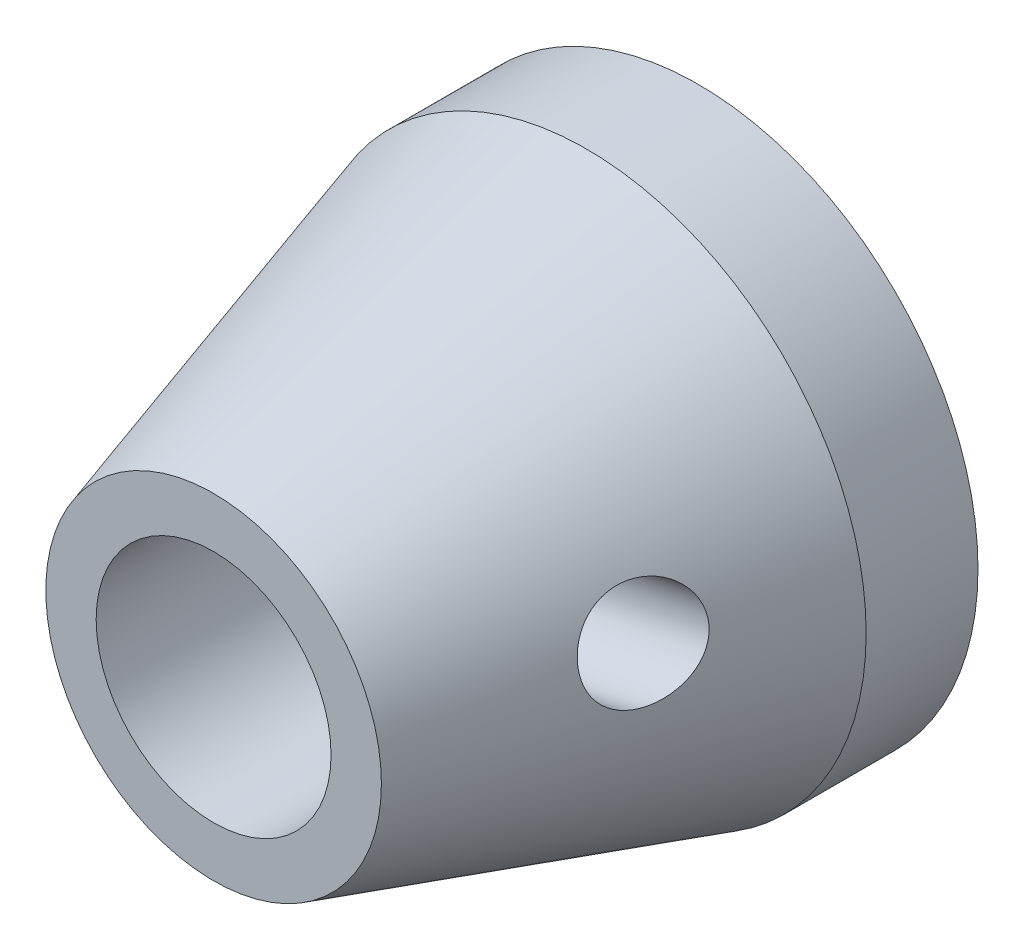
ISO-10303-21;
HEADER;
FILE_DESCRIPTION(('STEP AP214'),'2;1');
FILE_NAME('part.step','',(''),(''),'','','');
FILE_SCHEMA(('AUTOMOTIVE_DESIGN { 1 0 10303 214 1 1 1 1 }'));
ENDSEC;
DATA;
#1=APPLICATION_CONTEXT('core data for automotive mechanical design processes');
#2=APPLICATION_PROTOCOL_DEFINITION('international standard','automotive_design',2000,#1);
#3=PRODUCT_CONTEXT('',#1,'mechanical');
#4=PRODUCT('Part','Part','',(#3));
#5=PRODUCT_RELATED_PRODUCT_CATEGORY('part','',(#4));
#6=PRODUCT_DEFINITION_FORMATION('','',#4);
#7=PRODUCT_DEFINITION_CONTEXT('part definition',#1,'design');
#8=PRODUCT_DEFINITION('design','',#6,#7);
#9=PRODUCT_DEFINITION_SHAPE('','',#8);
#10=(LENGTH_UNIT() NAMED_UNIT(*) SI_UNIT(.MILLI.,.METRE.));
#11=(NAMED_UNIT(*) PLANE_ANGLE_UNIT() SI_UNIT($,.RADIAN.));
#12=(NAMED_UNIT(*) SI_UNIT($,.STERADIAN.) SOLID_ANGLE_UNIT());
#13=UNCERTAINTY_MEASURE_WITH_UNIT(LENGTH_MEASURE(1.E-05),#10,'distance_accuracy_value','');
#14=(GEOMETRIC_REPRESENTATION_CONTEXT(3) GLOBAL_UNCERTAINTY_ASSIGNED_CONTEXT((#13)) GLOBAL_UNIT_ASSIGNED_CONTEXT((#10,
#11,#12)) REPRESENTATION_CONTEXT('',''));
#15=CARTESIAN_POINT('',(0.,0.,0.));
#16=DIRECTION('',(0.,0.,1.));
#17=DIRECTION('',(1.,0.,0.));
#18=AXIS2_PLACEMENT_3D('',#15,#16,#17);
#19=CARTESIAN_POINT('',(18.1431082575943,29.9368359977339,3.));
#20=DIRECTION('',(0.,0.,-1.));
#21=DIRECTION('',(-1.,0.,0.));
#22=AXIS2_PLACEMENT_3D('',#19,#20,#21);
#23=CYLINDRICAL_SURFACE('',#22,7.5);
#24=CARTESIAN_POINT('',(18.1431082575943,29.9368359977339,3.));
#25=DIRECTION('',(0.,0.,1.));
#26=DIRECTION('',(1.,0.,0.));
#27=AXIS2_PLACEMENT_3D('',#24,#25,#26);
#28=CIRCLE('',#27,7.5);
#29=CARTESIAN_POINT('',(25.6431082575943,29.9368359977339,3.));
#30=VERTEX_POINT('',#29);
#31=EDGE_CURVE('E55',#30,#30,#28,.T.);
#32=ORIENTED_EDGE('',*,*,#31,.F.);
#33=EDGE_LOOP('',(#32));
#34=FACE_BOUND('',#33,.T.);
#35=CARTESIAN_POINT('',(18.1431082575943,29.9368359977339,0.));
#36=DIRECTION('',(0.,0.,1.));
#37=DIRECTION('',(1.,0.,0.));
#38=AXIS2_PLACEMENT_3D('',#35,#36,#37);
#39=CIRCLE('',#38,7.5);
#40=CARTESIAN_POINT('',(25.6431082575943,29.9368359977339,0.));
#41=VERTEX_POINT('',#40);
#42=EDGE_CURVE('E60',#41,#41,#39,.T.);
#43=ORIENTED_EDGE('',*,*,#42,.T.);
#44=EDGE_LOOP('',(#43));
#45=FACE_BOUND('',#44,.T.);
#46=ADVANCED_FACE('F41',(#34,#45),#23,.T.);
#47=CARTESIAN_POINT('',(18.1431082575943,29.9368359977339,0.));
#48=DIRECTION('',(0.,0.,1.));
#49=DIRECTION('',(1.,0.,0.));
#50=AXIS2_PLACEMENT_3D('',#47,#48,#49);
#51=PLANE('',#50);
#52=CARTESIAN_POINT('',(18.1431082575943,29.9368359977339,0.));
#53=DIRECTION('',(0.,0.,1.));
#54=DIRECTION('',(1.,0.,0.));
#55=AXIS2_PLACEMENT_3D('',#52,#53,#54);
#56=CIRCLE('',#55,1.65);
#57=CARTESIAN_POINT('',(19.7931082575943,29.9368359977339,0.));
#58=VERTEX_POINT('',#57);
#59=EDGE_CURVE('E123',#58,#58,#56,.F.);
#60=ORIENTED_EDGE('',*,*,#59,.F.);
#61=EDGE_LOOP('',(#60));
#62=FACE_BOUND('',#61,.T.);
#63=ORIENTED_EDGE('',*,*,#42,.F.);
#64=EDGE_LOOP('',(#63));
#65=FACE_BOUND('',#64,.T.);
#66=ADVANCED_FACE('F101',(#62,#65),#51,.F.);
#67=CARTESIAN_POINT('',(18.1431082575943,29.9368359977339,13.));
#68=DIRECTION('',(0.,0.,1.));
#69=DIRECTION('',(1.,0.,0.));
#70=AXIS2_PLACEMENT_3D('',#67,#68,#69);
#71=PLANE('',#70);
#72=CARTESIAN_POINT('',(18.1431082575943,29.9368359977339,13.));
#73=DIRECTION('',(0.,0.,1.));
#74=DIRECTION('',(1.,0.,0.));
#75=AXIS2_PLACEMENT_3D('',#72,#73,#74);
#76=CIRCLE('',#75,4.5);
#77=CARTESIAN_POINT('',(22.6431082575943,29.9368359977339,13.));
#78=VERTEX_POINT('',#77);
#79=EDGE_CURVE('E117',#78,#78,#76,.T.);
#80=ORIENTED_EDGE('',*,*,#79,.T.);
#81=EDGE_LOOP('',(#80));
#82=FACE_BOUND('',#81,.T.);
#83=CARTESIAN_POINT('',(18.1431082575943,29.9368359977339,13.));
#84=DIRECTION('',(0.,0.,1.));
#85=DIRECTION('',(1.,0.,0.));
#86=AXIS2_PLACEMENT_3D('',#83,#84,#85);
#87=CIRCLE('',#86,3.15);
#88=CARTESIAN_POINT('',(21.2931082575943,29.9368359977339,13.));
#89=VERTEX_POINT('',#88);
#90=EDGE_CURVE('E119',#89,#89,#87,.T.);
#91=ORIENTED_EDGE('',*,*,#90,.F.);
#92=EDGE_LOOP('',(#91));
#93=FACE_BOUND('',#92,.T.);
#94=ADVANCED_FACE('F96',(#82,#93),#71,.T.);
#95=CARTESIAN_POINT('',(18.1431082575943,29.9368359977339,13.));
#96=DIRECTION('',(0.,0.,-1.));
#97=DIRECTION('',(-1.,0.,0.));
#98=AXIS2_PLACEMENT_3D('',#95,#96,#97);
#99=CYLINDRICAL_SURFACE('',#98,3.15);
#100=CARTESIAN_POINT('',(14.9931082575943,29.9368359977339,8.6903802701411));
#101=CARTESIAN_POINT('',(14.9931102999461,29.8732132676432,8.72370931606805));
#102=CARTESIAN_POINT('',(14.9950505986868,29.8070080103212,8.75229520565875));
#103=CARTESIAN_POINT('',(15.0035908596131,29.6711896883862,8.798976753954));
#104=CARTESIAN_POINT('',(15.0101974703728,29.6015718934447,8.81705737765284));
#105=CARTESIAN_POINT('',(15.0284677580875,29.4608646789268,8.84198872866573));
#106=CARTESIAN_POINT('',(15.0401389585906,29.3897732203883,8.84882267615486));
#107=CARTESIAN_POINT('',(15.0684052478466,29.2484373848096,8.850897276917));
#108=CARTESIAN_POINT('',(15.0849980980908,29.1781926377431,8.8461431936816));
#109=CARTESIAN_POINT('',(15.121910794454,29.0425961940166,8.82557138585311));
#110=CARTESIAN_POINT('',(15.1421093683967,28.9771618103116,8.81007665355229));
#111=CARTESIAN_POINT('',(15.1855509156751,28.8506344207,8.76896460983401));
#112=CARTESIAN_POINT('',(15.2087946047318,28.7895424406515,8.74334491579106));
#113=CARTESIAN_POINT('',(15.257927086223,28.6709397776285,8.68177277019199));
#114=CARTESIAN_POINT('',(15.2838794442189,28.6136251792924,8.64549453545055));
#115=CARTESIAN_POINT('',(15.3362120939258,28.5059539075079,8.56401000361812));
#116=CARTESIAN_POINT('',(15.3625925628893,28.4556002027075,8.51879991715836));
#117=CARTESIAN_POINT('',(15.4161128865017,28.3590951722122,8.41675925546413));
#118=CARTESIAN_POINT('',(15.4431606668415,28.313544608485,8.35931048806948));
#119=CARTESIAN_POINT('',(15.4938076812394,28.2321333885885,8.2365274257616));
#120=CARTESIAN_POINT('',(15.5174060908371,28.1962750472976,8.17119125241085));
#121=CARTESIAN_POINT('',(15.5593305516761,28.1346127458998,8.03314268948219));
#122=CARTESIAN_POINT('',(15.5775786007019,28.1089557625159,7.96034024693515));
#123=CARTESIAN_POINT('',(15.6063302001096,28.0692519907563,7.81019757533648));
#124=CARTESIAN_POINT('',(15.6168407176798,28.0551947561121,7.73286149647984));
#125=CARTESIAN_POINT('',(15.6283147965662,28.0398921889111,7.58272004634911));
#126=CARTESIAN_POINT('',(15.6299937043849,28.037686545542,7.5100664814923));
#127=CARTESIAN_POINT('',(15.6255449150962,28.0435878033745,7.36542876920287));
#128=CARTESIAN_POINT('',(15.6194183116316,28.051693259871,7.29344452941338));
#129=CARTESIAN_POINT('',(15.6005182889504,28.0772745730684,7.15574778421628));
#130=CARTESIAN_POINT('',(15.5880786912904,28.0942810516217,7.08990014599403));
#131=CARTESIAN_POINT('',(15.5578952996415,28.1368771427343,6.96233549165208));
#132=CARTESIAN_POINT('',(15.5401500293559,28.1624691444468,6.90061963105168));
#133=CARTESIAN_POINT('',(15.4994660756599,28.2236264775347,6.77868807451138));
#134=CARTESIAN_POINT('',(15.4762643231326,28.2597330341089,6.71883219601746));
#135=CARTESIAN_POINT('',(15.4271903802773,28.3404278071716,6.60635109748906));
#136=CARTESIAN_POINT('',(15.4013169277564,28.3850200410163,6.55372932268774));
#137=CARTESIAN_POINT('',(15.3466048847592,28.4857685103556,6.4530557577431));
#138=CARTESIAN_POINT('',(15.3176913584886,28.542550676542,6.405667553977));
#139=CARTESIAN_POINT('',(15.2608650551166,28.6641724693107,6.3218758661977));
#140=CARTESIAN_POINT('',(15.2329521533182,28.729011087375,6.28547100922571));
#141=CARTESIAN_POINT('',(15.1805704826976,28.8639880168436,6.22554238706371));
#142=CARTESIAN_POINT('',(15.1560451353999,28.9339982237519,6.20178112896172));
#143=CARTESIAN_POINT('',(15.1113800197387,29.0784508990138,6.167121220823));
#144=CARTESIAN_POINT('',(15.0912375848393,29.1528906371613,6.15621473208541));
#145=CARTESIAN_POINT('',(15.0577240840396,29.2980600736766,6.14809924687948));
#146=CARTESIAN_POINT('',(15.0439565961178,29.3686455537662,6.1499182575943));
#147=CARTESIAN_POINT('',(15.0214296211514,29.5094008067714,6.16490085463192));
#148=CARTESIAN_POINT('',(15.0126697510674,29.5795706110761,6.17806357306633));
#149=CARTESIAN_POINT('',(15.00012238538,29.7160458586902,6.21481334315896));
#150=CARTESIAN_POINT('',(14.9962393233295,29.7824004345599,6.23818753628852));
#151=CARTESIAN_POINT('',(14.9925560875365,29.9110288426966,6.29450035550992));
#152=CARTESIAN_POINT('',(14.992756868607,29.9733017172369,6.32744121653859));
#153=CARTESIAN_POINT('',(14.9964929991104,30.0958794650638,6.40419707965138));
#154=CARTESIAN_POINT('',(15.0002266837405,30.1558449676796,6.44854381568185));
#155=CARTESIAN_POINT('',(15.010070022512,30.2681274530824,6.54585496528117));
#156=CARTESIAN_POINT('',(15.0161809303462,30.3204403800123,6.59882391742225));
#157=CARTESIAN_POINT('',(15.0298247341782,30.419129114165,6.71594038840492));
#158=CARTESIAN_POINT('',(15.0374239020023,30.464904812631,6.78058839950458));
#159=CARTESIAN_POINT('',(15.0520236845114,30.5445729939757,6.91691126212507));
#160=CARTESIAN_POINT('',(15.059024455735,30.5784685918856,6.98858426533552));
#161=CARTESIAN_POINT('',(15.0706581150524,30.6320242570857,7.13496094602848));
#162=CARTESIAN_POINT('',(15.0753526505968,30.6520615627288,7.20952057752174));
#163=CARTESIAN_POINT('',(15.0815790051972,30.6782734334692,7.36114829270059));
#164=CARTESIAN_POINT('',(15.0831132799977,30.6844587628505,7.43821438135033));
#165=CARTESIAN_POINT('',(15.0826835952195,30.6826873322882,7.58529082038846));
#166=CARTESIAN_POINT('',(15.0810183248014,30.6759381996436,7.65531972335324));
#167=CARTESIAN_POINT('',(15.075108232488,30.6510049707577,7.79318558873972));
#168=CARTESIAN_POINT('',(15.0708633283911,30.6328205101222,7.86102248123915));
#169=CARTESIAN_POINT('',(15.0606229828806,30.5859522861719,7.99253064032278));
#170=CARTESIAN_POINT('',(15.0546335185566,30.5573042885632,8.05621523626327));
#171=CARTESIAN_POINT('',(15.0419719894604,30.4905549053651,8.17838808276881));
#172=CARTESIAN_POINT('',(15.0352993369767,30.4524453396399,8.23687177708087));
#173=CARTESIAN_POINT('',(15.0218855808405,30.3641896793113,8.35239898835284));
#174=CARTESIAN_POINT('',(15.0151900242661,30.3132799839146,8.40886395678522));
#175=CARTESIAN_POINT('',(15.0038975401614,30.2031165074626,8.51304816710982));
#176=CARTESIAN_POINT('',(14.9992965334467,30.1438792417329,8.5607842991297));
#177=CARTESIAN_POINT('',(14.9953565583146,30.0580849197158,8.61942832390792));
#178=CARTESIAN_POINT('',(14.9945283756841,30.0344293861019,8.6346033240437));
#179=CARTESIAN_POINT('',(14.9934037779994,29.9862599630836,8.6635548360569));
#180=CARTESIAN_POINT('',(14.9931074579614,29.9617459211057,8.67733109763763));
#181=CARTESIAN_POINT('',(14.9931082575943,29.9368359977339,8.6903802701411));
#182=B_SPLINE_CURVE_WITH_KNOTS('',3,(#100,#101,#102,#103,#104,#105,#106,#107,#108,#109,#110,
#111,#112,#113,#114,#115,#116,#117,#118,#119,#120,#121,#122,#123,#124,#125,#126,#127,#128,#129,
#130,#131,#132,#133,#134,#135,#136,#137,#138,#139,#140,#141,#142,#143,#144,#145,#146,#147,#148,
#149,#150,#151,#152,#153,#154,#155,#156,#157,#158,#159,#160,#161,#162,#163,#164,#165,#166,#167,
#168,#169,#170,#171,#172,#173,#174,#175,#176,#177,#178,#179,#180,#181),.UNSPECIFIED.,.T.,.F.,(4,
2,2,2,2,2,2,2,2,2,2,2,2,2,2,2,2,2,2,2,2,2,2,2,2,2,2,2,2,2,2,2,2,2,2,2,2,2,2,2,4),(0.,
0.215371954980914,0.431051393154338,0.647052330136701,0.862955173899661,1.07263209017435,
1.28235837743291,1.49931524856291,1.71636436281924,1.94973540170888,2.18316212949799,
2.4198396693578,2.65630383358105,2.87328210404809,3.09022997668048,3.29674460097989,
3.50331674127458,3.72334981351538,3.94348731588041,4.18057024762912,4.41762353084774,
4.65005107796544,4.88233681980285,5.09708495222221,5.31181665607438,5.52227124250676,
5.73277503432513,5.95584444437429,6.17903165593587,6.41660616663915,6.65411833724638,
6.88487960297263,7.11546148324764,7.32555737183917,7.53565995561171,7.74505100184066,
7.95462371441831,8.18261944062646,8.41016922008784,8.49447777969649,8.57880139937391),.UNSPECIFIED.);
#183=CARTESIAN_POINT('',(14.9931082575943,29.9368359977339,8.6903802701411));
#184=VERTEX_POINT('',#183);
#185=EDGE_CURVE('E86',#184,#184,#182,.T.);
#186=ORIENTED_EDGE('',*,*,#185,.F.);
#187=EDGE_LOOP('',(#186));
#188=FACE_BOUND('',#187,.T.);
#189=CARTESIAN_POINT('',(21.2033056976846,29.1900484592298,7.5));
#190=CARTESIAN_POINT('',(21.2033123331083,29.1900586648814,7.57179203974133));
#191=CARTESIAN_POINT('',(21.2048400353248,29.1962497182343,7.64369232747785));
#192=CARTESIAN_POINT('',(21.2106517232002,29.220718831068,7.78540499676614));
#193=CARTESIAN_POINT('',(21.2149429892816,29.2390288206157,7.85521135212466));
#194=CARTESIAN_POINT('',(21.2253896481857,29.2867356099237,7.99042434761806));
#195=CARTESIAN_POINT('',(21.2315371202108,29.3160854288203,8.05584826680994));
#196=CARTESIAN_POINT('',(21.2445373632063,29.3847019420582,8.18113613649208));
#197=CARTESIAN_POINT('',(21.2513899955786,29.4239666898347,8.24100117518709));
#198=CARTESIAN_POINT('',(21.2649255226369,29.5138244942902,8.35745242405488));
#199=CARTESIAN_POINT('',(21.2715737595632,29.5649545860029,8.41362845773381));
#200=CARTESIAN_POINT('',(21.2827481359544,29.6755863489937,8.51731619916038));
#201=CARTESIAN_POINT('',(21.2872734302395,29.735091342228,8.56482445152406));
#202=CARTESIAN_POINT('',(21.2929521272611,29.8638843039658,8.65196355417216));
#203=CARTESIAN_POINT('',(21.2939394938036,29.9334979080979,8.69112713561755));
#204=CARTESIAN_POINT('',(21.2907652361011,30.0781821345047,8.75728390279428));
#205=CARTESIAN_POINT('',(21.2866060267331,30.1532501818925,8.78428278833935));
#206=CARTESIAN_POINT('',(21.2726926650068,30.302192978715,8.82383925950499));
#207=CARTESIAN_POINT('',(21.2632568575722,30.3759085572793,8.83710572923458));
#208=CARTESIAN_POINT('',(21.2388781984814,30.5236078226104,8.85111721535495));
#209=CARTESIAN_POINT('',(21.2239377210617,30.5975913801924,8.85186762364035));
#210=CARTESIAN_POINT('',(21.19015077949,30.7386834022754,8.84118438804883));
#211=CARTESIAN_POINT('',(21.1716173446412,30.8059280042669,8.83053129002295));
#212=CARTESIAN_POINT('',(21.1309834842592,30.9367329666784,8.79868916910532));
#213=CARTESIAN_POINT('',(21.1088827952067,31.000293054445,8.77749936760797));
#214=CARTESIAN_POINT('',(21.061908815014,31.1232182864513,8.72494203462347));
#215=CARTESIAN_POINT('',(21.0369982709486,31.1825043526853,8.69342371844265));
#216=CARTESIAN_POINT('',(20.9860810163695,31.2947047633271,8.62125719008991));
#217=CARTESIAN_POINT('',(20.9600739147864,31.3476168081478,8.58060569796081));
#218=CARTESIAN_POINT('',(20.9065604835131,31.4499145039647,8.48783572199136));
#219=CARTESIAN_POINT('',(20.8790855309455,31.4987499141898,8.43509150859398));
#220=CARTESIAN_POINT('',(20.8265598727467,31.5873651593718,8.32138372576544));
#221=CARTESIAN_POINT('',(20.8015102161043,31.6271410858922,8.26041662681346));
#222=CARTESIAN_POINT('',(20.7550276184109,31.6981560119895,8.12919905646493));
#223=CARTESIAN_POINT('',(20.7337598695236,31.7290308222147,8.05869113443951));
#224=CARTESIAN_POINT('',(20.6982088603245,31.7793673176642,7.91206994614886));
#225=CARTESIAN_POINT('',(20.6839202714298,31.79883771242,7.83596100750555));
#226=CARTESIAN_POINT('',(20.66471206039,31.8247605504148,7.68577224199478));
#227=CARTESIAN_POINT('',(20.6592253724931,31.8320026622733,7.61190195873212));
#228=CARTESIAN_POINT('',(20.6564617129317,31.8356679864171,7.46375296119587));
#229=CARTESIAN_POINT('',(20.6591816151748,31.8320953183169,7.38947441320021));
#230=CARTESIAN_POINT('',(20.6720273553529,31.8149111500967,7.24806184181678));
#231=CARTESIAN_POINT('',(20.6816256886468,31.8020141377903,7.18078991683315));
#232=CARTESIAN_POINT('',(20.70669996926,31.7673962547001,7.0497095356332));
#233=CARTESIAN_POINT('',(20.722177344344,31.7456732403734,6.98590192505451));
#234=CARTESIAN_POINT('',(20.7584748919893,31.6928043593388,6.86045554936948));
#235=CARTESIAN_POINT('',(20.7794981043604,31.6612898638036,6.7990317051816));
#236=CARTESIAN_POINT('',(20.8248735383275,31.5898406492679,6.6826421825184));
#237=CARTESIAN_POINT('',(20.8492272559306,31.549902141945,6.62767942700529));
#238=CARTESIAN_POINT('',(20.9018055351754,31.4583833233171,6.52078698349835));
#239=CARTESIAN_POINT('',(20.9301824989457,31.4060921131759,6.46953814327283));
#240=CARTESIAN_POINT('',(20.9868597142205,31.2931421198725,6.37718959320282));
#241=CARTESIAN_POINT('',(21.0151599577614,31.2324824995943,6.33609089985554));
#242=CARTESIAN_POINT('',(21.069876462244,31.1036451329714,6.26516278967528));
#243=CARTESIAN_POINT('',(21.0962827843243,31.0354319150311,6.23538972950171));
#244=CARTESIAN_POINT('',(21.1452668868866,30.8934790010462,6.18863259049895));
#245=CARTESIAN_POINT('',(21.1678470857643,30.8197428387433,6.17164040966204));
#246=CARTESIAN_POINT('',(21.2063511695743,30.674580271917,6.15199014407337));
#247=CARTESIAN_POINT('',(21.2226413254499,30.6033799370144,6.14837378489008));
#248=CARTESIAN_POINT('',(21.250146217795,30.460392439219,6.15296797931014));
#249=CARTESIAN_POINT('',(21.2613619374998,30.3886053927558,6.16117624045474));
#250=CARTESIAN_POINT('',(21.278309971166,30.2494636299278,6.1884990916241));
#251=CARTESIAN_POINT('',(21.2842397031008,30.1820454002422,6.20717428533945));
#252=CARTESIAN_POINT('',(21.2917458987167,30.0505205052547,6.25440722872897));
#253=CARTESIAN_POINT('',(21.2933215606806,29.9864144519578,6.28296679732932));
#254=CARTESIAN_POINT('',(21.2928376923784,29.8602459827444,6.35060566012319));
#255=CARTESIAN_POINT('',(21.2906090258735,29.7984102548672,6.39010546736101));
#256=CARTESIAN_POINT('',(21.2832913619921,29.6815213155669,6.47790596824713));
#257=CARTESIAN_POINT('',(21.2782012312395,29.6264708021894,6.52621014402576));
#258=CARTESIAN_POINT('',(21.2659951593817,29.5207702424316,6.63437595778368));
#259=CARTESIAN_POINT('',(21.2587589337482,29.4707302090851,6.69482220744656));
#260=CARTESIAN_POINT('',(21.2441090004343,29.3815480490568,6.82334333192865));
#261=CARTESIAN_POINT('',(21.2366951921678,29.3424122652356,6.8914226146323));
#262=CARTESIAN_POINT('',(21.2233484179585,29.276724363947,7.03341621288813));
#263=CARTESIAN_POINT('',(21.2174128000003,29.2501496326613,7.10731976081231));
#264=CARTESIAN_POINT('',(21.2084055746911,29.2109754131417,7.25875966193316));
#265=CARTESIAN_POINT('',(21.2053243663551,29.1983290486606,7.33628290885938));
#266=CARTESIAN_POINT('',(21.2035422922077,29.1910232249061,7.44275896042898));
#267=CARTESIAN_POINT('',(21.2033030516198,29.1900443894347,7.47137087318114));
#268=CARTESIAN_POINT('',(21.2033056976846,29.1900484592298,7.5));
#269=B_SPLINE_CURVE_WITH_KNOTS('',3,(#189,#190,#191,#192,#193,#194,#195,#196,#197,#198,#199,
#200,#201,#202,#203,#204,#205,#206,#207,#208,#209,#210,#211,#212,#213,#214,#215,#216,#217,#218,
#219,#220,#221,#222,#223,#224,#225,#226,#227,#228,#229,#230,#231,#232,#233,#234,#235,#236,#237,
#238,#239,#240,#241,#242,#243,#244,#245,#246,#247,#248,#249,#250,#251,#252,#253,#254,#255,#256,
#257,#258,#259,#260,#261,#262,#263,#264,#265,#266,#267,#268),.UNSPECIFIED.,.T.,.F.,(4,2,2,2,2,2,
2,2,2,2,2,2,2,2,2,2,2,2,2,2,2,2,2,2,2,2,2,2,2,2,2,2,2,2,2,2,2,2,2,4),(0.,0.215290365298773,
0.431150231632768,0.646101695386732,0.861010991204238,1.08877233179749,1.31662427128907,
1.55503878456367,1.7933414713596,2.01861464127891,2.2437907614524,2.45448407328556,
2.66519295653294,2.8791262549714,3.0931365054887,3.32297486895062,3.55291220209857,
3.79123420837128,4.02937397045064,4.25144688787891,4.47343522293967,4.68000522764641,
4.88662543136915,5.10222922897094,5.31793019224827,5.5524135349924,5.78692035080585,
6.0225792721145,6.258088679196,6.47635747004704,6.69458395046048,6.90427002832682,
7.11399471323397,7.33328812193355,7.55266845017973,7.78798253486696,8.02343321429723,
8.25845837906556,8.49269012087168,8.57854330450073),.UNSPECIFIED.);
#270=CARTESIAN_POINT('',(21.2033056976846,29.1900484592298,7.5));
#271=VERTEX_POINT('',#270);
#272=EDGE_CURVE('E81',#271,#271,#269,.T.);
#273=ORIENTED_EDGE('',*,*,#272,.F.);
#274=EDGE_LOOP('',(#273));
#275=FACE_BOUND('',#274,.T.);
#276=ORIENTED_EDGE('',*,*,#90,.T.);
#277=EDGE_LOOP('',(#276));
#278=FACE_BOUND('',#277,.T.);
#279=CARTESIAN_POINT('',(18.1431082575943,29.9368359977339,3.));
#280=DIRECTION('',(0.,0.,1.));
#281=DIRECTION('',(1.,0.,0.));
#282=AXIS2_PLACEMENT_3D('',#279,#280,#281);
#283=CIRCLE('',#282,3.15);
#284=CARTESIAN_POINT('',(21.2931082575943,29.9368359977339,3.));
#285=VERTEX_POINT('',#284);
#286=EDGE_CURVE('E10',#285,#285,#283,.F.);
#287=ORIENTED_EDGE('',*,*,#286,.T.);
#288=EDGE_LOOP('',(#287));
#289=FACE_BOUND('',#288,.T.);
#290=ADVANCED_FACE('F91',(#188,#275,#278,#289),#99,.F.);
#291=CARTESIAN_POINT('',(18.1431082575943,29.9368359977339,3.));
#292=DIRECTION('',(0.,0.,1.));
#293=DIRECTION('',(1.,0.,0.));
#294=AXIS2_PLACEMENT_3D('',#291,#292,#293);
#295=PLANE('',#294);
#296=CARTESIAN_POINT('',(18.1431082575943,29.9368359977339,3.));
#297=DIRECTION('',(0.,0.,1.));
#298=DIRECTION('',(1.,0.,0.));
#299=AXIS2_PLACEMENT_3D('',#296,#297,#298);
#300=CIRCLE('',#299,1.65);
#301=CARTESIAN_POINT('',(19.7931082575943,29.9368359977339,3.));
#302=VERTEX_POINT('',#301);
#303=EDGE_CURVE('E127',#302,#302,#300,.T.);
#304=ORIENTED_EDGE('',*,*,#303,.F.);
#305=EDGE_LOOP('',(#304));
#306=FACE_BOUND('',#305,.T.);
#307=ORIENTED_EDGE('',*,*,#286,.F.);
#308=EDGE_LOOP('',(#307));
#309=FACE_BOUND('',#308,.T.);
#310=ADVANCED_FACE('F95',(#306,#309),#295,.T.);
#311=CARTESIAN_POINT('',(18.1431082575943,29.9368359977339,-4.66690475583121));
#312=DIRECTION('',(0.,0.,1.));
#313=DIRECTION('',(1.,0.,0.));
#314=AXIS2_PLACEMENT_3D('',#311,#312,#313);
#315=CYLINDRICAL_SURFACE('',#314,1.65);
#316=ORIENTED_EDGE('',*,*,#59,.T.);
#317=EDGE_LOOP('',(#316));
#318=FACE_BOUND('',#317,.T.);
#319=ORIENTED_EDGE('',*,*,#303,.T.);
#320=EDGE_LOOP('',(#319));
#321=FACE_BOUND('',#320,.T.);
#322=ADVANCED_FACE('F74',(#318,#321),#315,.F.);
#323=CARTESIAN_POINT('',(18.1431082575943,29.9368359977339,12.9999999999999));
#324=DIRECTION('',(0.,0.,-1.));
#325=DIRECTION('',(-1.,0.,0.));
#326=AXIS2_PLACEMENT_3D('',#323,#324,#325);
#327=CONICAL_SURFACE('',#326,4.5,0.29145679447787);
#328=CARTESIAN_POINT('',(12.1742033380545,27.6239189500116,6.66213287777971));
#329=CARTESIAN_POINT('',(12.1399832974759,27.6639012882432,6.60392549325356));
#330=CARTESIAN_POINT('',(12.1055676927706,27.708942043026,6.54928071087642));
#331=CARTESIAN_POINT('',(12.0377632866389,27.8085284406471,6.44863138779503));
#332=CARTESIAN_POINT('',(12.004374722526,27.8630762611157,6.40262883165347));
#333=CARTESIAN_POINT('',(11.9400170335179,27.9809892152529,6.3206944799936));
#334=CARTESIAN_POINT('',(11.9090586090255,28.0443902638856,6.28480559863053));
#335=CARTESIAN_POINT('',(11.8513208812135,28.1783307756838,6.22496101094675));
#336=CARTESIAN_POINT('',(11.8245388753502,28.2488655734977,6.20099756553783));
#337=CARTESIAN_POINT('',(11.7784011934249,28.389415671517,6.16756349438031));
#338=CARTESIAN_POINT('',(11.7586380519639,28.4590697962728,6.15713705192302));
#339=CARTESIAN_POINT('',(11.7247769915671,28.6004805413083,6.1480874885238));
#340=CARTESIAN_POINT('',(11.710676869356,28.672236332225,6.14945977246026));
#341=CARTESIAN_POINT('',(11.6892837486937,28.8108300376875,6.16345014103996));
#342=CARTESIAN_POINT('',(11.6816088971398,28.8776853617308,6.1753338308131));
#343=CARTESIAN_POINT('',(11.6715500561646,29.0093163744851,6.20881321321423));
#344=CARTESIAN_POINT('',(11.6691663896753,29.0740919360261,6.23040949852503));
#345=CARTESIAN_POINT('',(11.6693554225474,29.201416954273,6.28307648880148));
#346=CARTESIAN_POINT('',(11.6720453355421,29.2638789247749,6.31435695213427));
#347=CARTESIAN_POINT('',(11.682020961229,29.3835562289626,6.38512136008275));
#348=CARTESIAN_POINT('',(11.6893081992216,29.4407698141203,6.4246080244348));
#349=CARTESIAN_POINT('',(11.7085941822841,29.5536736818702,6.51449694969221));
#350=CARTESIAN_POINT('',(11.7209536160922,29.6087783269896,6.56555688301917));
#351=CARTESIAN_POINT('',(11.7493313338447,29.7104182569986,6.67470805094537));
#352=CARTESIAN_POINT('',(11.7653513065928,29.7569495685935,6.73280252512357));
#353=CARTESIAN_POINT('',(11.8017187252708,29.8443828717992,6.86032684196276));
#354=CARTESIAN_POINT('',(11.8223285387471,29.8843748387951,6.93030774800073));
#355=CARTESIAN_POINT('',(11.8656603950054,29.9520086396297,7.07541636899725));
#356=CARTESIAN_POINT('',(11.888383034004,29.9796469745514,7.15054553515666));
#357=CARTESIAN_POINT('',(11.9356207696167,30.0222423366491,7.30654699730294));
#358=CARTESIAN_POINT('',(11.9601696480285,30.036777712757,7.38752527825036));
#359=CARTESIAN_POINT('',(12.009385139782,30.0507427115629,7.55074784732199));
#360=CARTESIAN_POINT('',(12.0340517149089,30.0501769426596,7.63299174156353));
#361=CARTESIAN_POINT('',(12.0816384521307,30.0337773857442,7.79253216447323));
#362=CARTESIAN_POINT('',(12.1045878522424,30.0186109413704,7.86988797122079));
#363=CARTESIAN_POINT('',(12.1493978729588,29.9740425549702,8.02071518944602));
#364=CARTESIAN_POINT('',(12.1712589218305,29.9446462620184,8.09418812954639));
#365=CARTESIAN_POINT('',(12.2124309574943,29.8745729650025,8.23030876463763));
#366=CARTESIAN_POINT('',(12.2318161947615,29.8346877703744,8.29334268201541));
#367=CARTESIAN_POINT('',(12.2695498527513,29.7442000020442,8.41153487996519));
#368=CARTESIAN_POINT('',(12.2878984004406,29.6935987443937,8.46669412624297));
#369=CARTESIAN_POINT('',(12.3233295782834,29.5846434313377,8.56609861484262));
#370=CARTESIAN_POINT('',(12.3404321423797,29.5265078336912,8.61057664578984));
#371=CARTESIAN_POINT('',(12.3740738853491,29.4033604237669,8.6889712897516));
#372=CARTESIAN_POINT('',(12.3906130607457,29.338348569068,8.722887837605));
#373=CARTESIAN_POINT('',(12.4233432928235,29.2031328211522,8.77927889122031));
#374=CARTESIAN_POINT('',(12.4395326637351,29.1329089219911,8.80170638850743));
#375=CARTESIAN_POINT('',(12.4714826741406,28.989572075462,8.83426651784468));
#376=CARTESIAN_POINT('',(12.4872433002972,28.9164590383916,8.84439876783975));
#377=CARTESIAN_POINT('',(12.518195654897,28.7689985784027,8.85210206736276));
#378=CARTESIAN_POINT('',(12.5333834480497,28.6946464029494,8.84959814675393));
#379=CARTESIAN_POINT('',(12.5626075799116,28.5472300555445,8.83192731226959));
#380=CARTESIAN_POINT('',(12.5766438944543,28.4741659106508,8.81676013269913));
#381=CARTESIAN_POINT('',(12.6028639238616,28.331275272724,8.77418156319507));
#382=CARTESIAN_POINT('',(12.6150460357342,28.26145161699,8.74675965852671));
#383=CARTESIAN_POINT('',(12.6366574788186,28.1270007193826,8.68047602484872));
#384=CARTESIAN_POINT('',(12.6460868954475,28.062373316313,8.64161465088472));
#385=CARTESIAN_POINT('',(12.6612041872515,27.9402816408228,8.55380707259724));
#386=CARTESIAN_POINT('',(12.6669069164821,27.8827896796564,8.50490193929467));
#387=CARTESIAN_POINT('',(12.6737406536884,27.7761580898576,8.39844008712148));
#388=CARTESIAN_POINT('',(12.6748721313154,27.7270176036902,8.3408842576551));
#389=CARTESIAN_POINT('',(12.6718887245655,27.6385974691118,8.21939135709233));
#390=CARTESIAN_POINT('',(12.6678108964719,27.599250523953,8.15550230726945));
#391=CARTESIAN_POINT('',(12.6541213667583,27.5307948077925,8.02301785793067));
#392=CARTESIAN_POINT('',(12.6445096883847,27.5016859937834,7.95442247818613));
#393=CARTESIAN_POINT('',(12.6196610465851,27.453927986773,7.81391672313645));
#394=CARTESIAN_POINT('',(12.6043710143347,27.4353817913943,7.74198086329258));
#395=CARTESIAN_POINT('',(12.5685768545924,27.4092861719748,7.59741555117757));
#396=CARTESIAN_POINT('',(12.5480710992379,27.4017401861325,7.52478588918991));
#397=CARTESIAN_POINT('',(12.5014840419685,27.3974007712266,7.37730607340802));
#398=CARTESIAN_POINT('',(12.4751884312435,27.4011217324622,7.30250895221845));
#399=CARTESIAN_POINT('',(12.4186738947937,27.4200953817539,7.15594099184837));
#400=CARTESIAN_POINT('',(12.388455211508,27.4353473574942,7.08416996602329));
#401=CARTESIAN_POINT('',(12.3280667734092,27.4751116324329,6.95138660665514));
#402=CARTESIAN_POINT('',(12.2981297145078,27.4986841555839,6.88998438461298));
#403=CARTESIAN_POINT('',(12.2369178964284,27.5547208992484,6.77209670441123));
#404=CARTESIAN_POINT('',(12.2056431560515,27.5871849948249,6.71561117718101));
#405=CARTESIAN_POINT('',(12.1742033380545,27.6239189500116,6.66213287777971));
#406=B_SPLINE_CURVE_WITH_KNOTS('',3,(#328,#329,#330,#331,#332,#333,#334,#335,#336,#337,#338,
#339,#340,#341,#342,#343,#344,#345,#346,#347,#348,#349,#350,#351,#352,#353,#354,#355,#356,#357,
#358,#359,#360,#361,#362,#363,#364,#365,#366,#367,#368,#369,#370,#371,#372,#373,#374,#375,#376,
#377,#378,#379,#380,#381,#382,#383,#384,#385,#386,#387,#388,#389,#390,#391,#392,#393,#394,#395,
#396,#397,#398,#399,#400,#401,#402,#403,#404,#405),.UNSPECIFIED.,.T.,.F.,(4,2,2,2,2,2,2,2,2,2,2,
2,2,2,2,2,2,2,2,2,2,2,2,2,2,2,2,2,2,2,2,2,2,2,2,2,2,2,4),(0.,0.235184821822686,
0.470423584610195,0.706645973932468,0.942714864658663,1.1609994757296,1.37919907771976,
1.58326116562387,1.78733570751185,1.99618275364453,2.20509912751351,2.43255321558579,
2.66011245310905,2.90857964745846,3.157117170607,3.4133933629615,3.66959134870813,
3.91460935938193,4.15953018059838,4.38960476470135,4.61965110945796,4.84410315557514,
5.0685565864659,5.29392119708913,5.51929281037618,5.74600311511795,5.97271817671545,
6.1996281377722,6.42653105699037,6.65252396550504,6.87849365487877,7.10286482865359,
7.32723505989918,7.5537572618095,7.78035024977338,8.01744182748002,8.25451876031275,
8.47059892157542,8.68667604681417),.UNSPECIFIED.);
#407=CARTESIAN_POINT('',(12.1742033380545,27.6239189500116,6.66213287777971));
#408=VERTEX_POINT('',#407);
#409=EDGE_CURVE('E47',#408,#408,#406,.T.);
#410=ORIENTED_EDGE('',*,*,#409,.T.);
#411=EDGE_LOOP('',(#410));
#412=FACE_BOUND('',#411,.T.);
#413=CARTESIAN_POINT('',(24.4738807609678,30.0108157322259,6.89598419189548));
#414=CARTESIAN_POINT('',(24.4531555355169,29.9704475277235,6.96663806754924));
#415=CARTESIAN_POINT('',(24.4310497970103,29.9361297189603,7.04039843056587));
#416=CARTESIAN_POINT('',(24.3852222270699,29.8806849859207,7.19231987779416));
#417=CARTESIAN_POINT('',(24.3614989261086,29.8595702383539,7.27048495211582));
#418=CARTESIAN_POINT('',(24.3134285861324,29.8314973094929,7.42932611483308));
#419=CARTESIAN_POINT('',(24.2890804837922,29.8245651407304,7.51000654213543));
#420=CARTESIAN_POINT('',(24.2406918522432,29.8256735670973,7.67134554492472));
#421=CARTESIAN_POINT('',(24.2166511603195,29.8337058805306,7.75200410780545));
#422=CARTESIAN_POINT('',(24.1705833538031,29.8642665127273,7.90701782450665));
#423=CARTESIAN_POINT('',(24.1485143635856,29.8861211486305,7.98149296901557));
#424=CARTESIAN_POINT('',(24.1055423488658,29.9433192807735,8.1254339245811));
#425=CARTESIAN_POINT('',(24.0846390098557,29.9786591181516,8.194901088351));
#426=CARTESIAN_POINT('',(24.0451356630824,30.0595363463705,8.32276369202544));
#427=CARTESIAN_POINT('',(24.0264722269128,30.1044191823926,8.38155465140096));
#428=CARTESIAN_POINT('',(23.9900716857498,30.2039593139637,8.49051406552677));
#429=CARTESIAN_POINT('',(23.9723345033446,30.2586157909849,8.54068324164914));
#430=CARTESIAN_POINT('',(23.9378135938095,30.3751018844917,8.63013903245993));
#431=CARTESIAN_POINT('',(23.9210196493689,30.4368135443833,8.66957552986205));
#432=CARTESIAN_POINT('',(23.8879065462943,30.5661658949626,8.73736613028257));
#433=CARTESIAN_POINT('',(23.8715873967915,30.6338066995781,8.76572002029272));
#434=CARTESIAN_POINT('',(23.8392411860127,30.7734539576074,8.81066818008471));
#435=CARTESIAN_POINT('',(23.8232166467085,30.8454854698692,8.82718641022323));
#436=CARTESIAN_POINT('',(23.7916817971681,30.9914210445751,8.84769504710525));
#437=CARTESIAN_POINT('',(23.776171502383,31.0653251631667,8.85168507775924));
#438=CARTESIAN_POINT('',(23.7459468050197,31.2132574356233,8.84701178629082));
#439=CARTESIAN_POINT('',(23.7312364587646,31.2872845562166,8.83828926921031));
#440=CARTESIAN_POINT('',(23.7032910541754,31.4330524713354,8.80833337593045));
#441=CARTESIAN_POINT('',(23.6900560181115,31.504793231336,8.7870998109041));
#442=CARTESIAN_POINT('',(23.6658709323727,31.6440154445295,8.7327452173344));
#443=CARTESIAN_POINT('',(23.6549203965182,31.7114978018448,8.69962672219152));
#444=CARTESIAN_POINT('',(23.6362358357875,31.8404055415093,8.62248926921639));
#445=CARTESIAN_POINT('',(23.6285016353908,31.9018312542396,8.5784709064162));
#446=CARTESIAN_POINT('',(23.6172265385457,32.0166968135028,8.48115352549763));
#447=CARTESIAN_POINT('',(23.6136632680469,32.0701779136721,8.4279058014296));
#448=CARTESIAN_POINT('',(23.6114590209896,32.1681957652109,8.31365132706816));
#449=CARTESIAN_POINT('',(23.6128175605081,32.2127333954672,8.25264534015302));
#450=CARTESIAN_POINT('',(23.6209693657732,32.291621198742,8.12517803169876));
#451=CARTESIAN_POINT('',(23.6277323886684,32.3260266083508,8.05874890947573));
#452=CARTESIAN_POINT('',(23.6468231968372,32.384341508626,7.92219661823717));
#453=CARTESIAN_POINT('',(23.6591513558774,32.4082502941035,7.85207320138425));
#454=CARTESIAN_POINT('',(23.6894296827364,32.4456254362793,7.70890026615513));
#455=CARTESIAN_POINT('',(23.7074758531298,32.4588986978766,7.63582089466778));
#456=CARTESIAN_POINT('',(23.7485469235915,32.4743253927012,7.48989497027085));
#457=CARTESIAN_POINT('',(23.7715731113088,32.4764759464164,7.41704848252913));
#458=CARTESIAN_POINT('',(23.8231374832788,32.4697202323485,7.26944289399997));
#459=CARTESIAN_POINT('',(23.8519056069738,32.4602127268538,7.19479182635819));
#460=CARTESIAN_POINT('',(23.9129154289125,32.4295232174654,7.04940228523589));
#461=CARTESIAN_POINT('',(23.9451583896873,32.4083369586853,6.97866524808434));
#462=CARTESIAN_POINT('',(24.0137164481329,32.3532266451699,6.83886966254293));
#463=CARTESIAN_POINT('',(24.0501584841986,32.3186554288894,6.77012720500933));
#464=CARTESIAN_POINT('',(24.1238807558374,32.237545902098,6.64056661024571));
#465=CARTESIAN_POINT('',(24.1611611447936,32.1910053851864,6.57974993715914));
#466=CARTESIAN_POINT('',(24.2346372590328,32.0869070677821,6.46816986334111));
#467=CARTESIAN_POINT('',(24.270836932692,32.0293971089039,6.41736468639498));
#468=CARTESIAN_POINT('',(24.3404127460955,31.9043518458162,6.32749209066382));
#469=CARTESIAN_POINT('',(24.3737907929545,31.8368233994569,6.28841669750068));
#470=CARTESIAN_POINT('',(24.4331530289473,31.6996198677447,6.22666096901443));
#471=CARTESIAN_POINT('',(24.4595243147069,31.6306133632774,6.20287064635632));
#472=CARTESIAN_POINT('',(24.5068957915629,31.4877354361239,6.16794816067928));
#473=CARTESIAN_POINT('',(24.5279001038046,31.4138678013067,6.15680626252517));
#474=CARTESIAN_POINT('',(24.5618011918693,31.2710906372969,6.14822823338919));
#475=CARTESIAN_POINT('',(24.5752847938035,31.2023906309053,6.14957312016127));
#476=CARTESIAN_POINT('',(24.5966722066803,31.0651871937878,6.16301539878599));
#477=CARTESIAN_POINT('',(24.6045769555097,30.9966837319494,6.17511098251634));
#478=CARTESIAN_POINT('',(24.6147144756725,30.8634341183967,6.20909271094369));
#479=CARTESIAN_POINT('',(24.6170735423901,30.7986377844255,6.23074723223958));
#480=CARTESIAN_POINT('',(24.6168365842771,30.6727354286738,6.28293064822662));
#481=CARTESIAN_POINT('',(24.6142387872838,30.6116307347749,6.31346271348213));
#482=CARTESIAN_POINT('',(24.6043349585549,30.4907504286739,6.38455167708792));
#483=CARTESIAN_POINT('',(24.596743895456,30.4312984475994,6.4256171554243));
#484=CARTESIAN_POINT('',(24.5773809326724,30.3192685434203,6.5153632041609));
#485=CARTESIAN_POINT('',(24.565610048364,30.2666889550909,6.56404192352142));
#486=CARTESIAN_POINT('',(24.5410914464606,30.1779032011391,6.65866472989514));
#487=CARTESIAN_POINT('',(24.5288800161445,30.1404439142162,6.70358294408755));
#488=CARTESIAN_POINT('',(24.5026385491565,30.0712426184079,6.79713886945204));
#489=CARTESIAN_POINT('',(24.4886082064724,30.0395015737062,6.84577720592813));
#490=CARTESIAN_POINT('',(24.4738807609678,30.0108157322259,6.89598419189548));
#491=B_SPLINE_CURVE_WITH_KNOTS('',3,(#413,#414,#415,#416,#417,#418,#419,#420,#421,#422,#423,
#424,#425,#426,#427,#428,#429,#430,#431,#432,#433,#434,#435,#436,#437,#438,#439,#440,#441,#442,
#443,#444,#445,#446,#447,#448,#449,#450,#451,#452,#453,#454,#455,#456,#457,#458,#459,#460,#461,
#462,#463,#464,#465,#466,#467,#468,#469,#470,#471,#472,#473,#474,#475,#476,#477,#478,#479,#480,
#481,#482,#483,#484,#485,#486,#487,#488,#489,#490),.UNSPECIFIED.,.T.,.F.,(4,2,2,2,2,2,2,2,2,2,2,
2,2,2,2,2,2,2,2,2,2,2,2,2,2,2,2,2,2,2,2,2,2,2,2,2,2,2,4),(0.,0.251705313903478,0.50364242552153,
0.756041206932603,1.00830034642128,1.24912335182057,1.48988106251572,1.71762349752757,
1.94534686837369,2.1697045403235,2.39406652422648,2.61985733022679,2.84565491427594,
3.07250727164414,3.29936305294214,3.52617050619019,3.75296558057559,3.97853840405467,
4.20408904932783,4.42838630446078,4.65269862612592,4.88099664789607,5.10935376984409,
5.34999966211498,5.59073328620713,5.84495461480402,6.09922283976405,6.35240647001489,
6.60541758400287,6.83695575914568,7.06831560481076,7.27734658536194,7.4863424163717,
7.69053049623519,7.8947915904732,8.11186161425864,8.32887894269724,8.5077118310636,
8.68657484524542),.UNSPECIFIED.);
#492=CARTESIAN_POINT('',(24.4738807609678,30.0108157322259,6.89598419189548));
#493=VERTEX_POINT('',#492);
#494=EDGE_CURVE('E63',#493,#493,#491,.T.);
#495=ORIENTED_EDGE('',*,*,#494,.T.);
#496=EDGE_LOOP('',(#495));
#497=FACE_BOUND('',#496,.T.);
#498=ORIENTED_EDGE('',*,*,#31,.T.);
#499=EDGE_LOOP('',(#498));
#500=FACE_BOUND('',#499,.T.);
#501=ORIENTED_EDGE('',*,*,#79,.F.);
#502=EDGE_LOOP('',(#501));
#503=FACE_BOUND('',#502,.T.);
#504=ADVANCED_FACE('F44',(#412,#497,#500,#503),#327,.T.);
#505=CARTESIAN_POINT('',(26.8214630890727,31.7281837429822,7.5));
#506=DIRECTION('',(-0.979353769456508,-0.202153887549386,0.));
#507=DIRECTION('',(0.202153887549386,-0.979353769456508,0.));
#508=AXIS2_PLACEMENT_3D('',#505,#506,#507);
#509=CYLINDRICAL_SURFACE('',#508,1.35);
#510=ORIENTED_EDGE('',*,*,#272,.T.);
#511=EDGE_LOOP('',(#510));
#512=FACE_BOUND('',#511,.T.);
#513=ORIENTED_EDGE('',*,*,#494,.F.);
#514=EDGE_LOOP('',(#513));
#515=FACE_BOUND('',#514,.T.);
#516=ADVANCED_FACE('F72',(#512,#515),#509,.F.);
#517=ORIENTED_EDGE('',*,*,#185,.T.);
#518=EDGE_LOOP('',(#517));
#519=FACE_BOUND('',#518,.T.);
#520=ORIENTED_EDGE('',*,*,#409,.F.);
#521=EDGE_LOOP('',(#520));
#522=FACE_BOUND('',#521,.T.);
#523=ADVANCED_FACE('F68',(#519,#522),#509,.F.);
#524=CLOSED_SHELL('',(#46,#66,#94,#290,#310,#322,#504,#516,#523));
#525=MANIFOLD_SOLID_BREP('B2',#524);
#526=ADVANCED_BREP_SHAPE_REPRESENTATION('',(#18,#525),#14);
#527=SHAPE_DEFINITION_REPRESENTATION(#9,#526);
ENDSEC;
END-ISO-10303-21;
